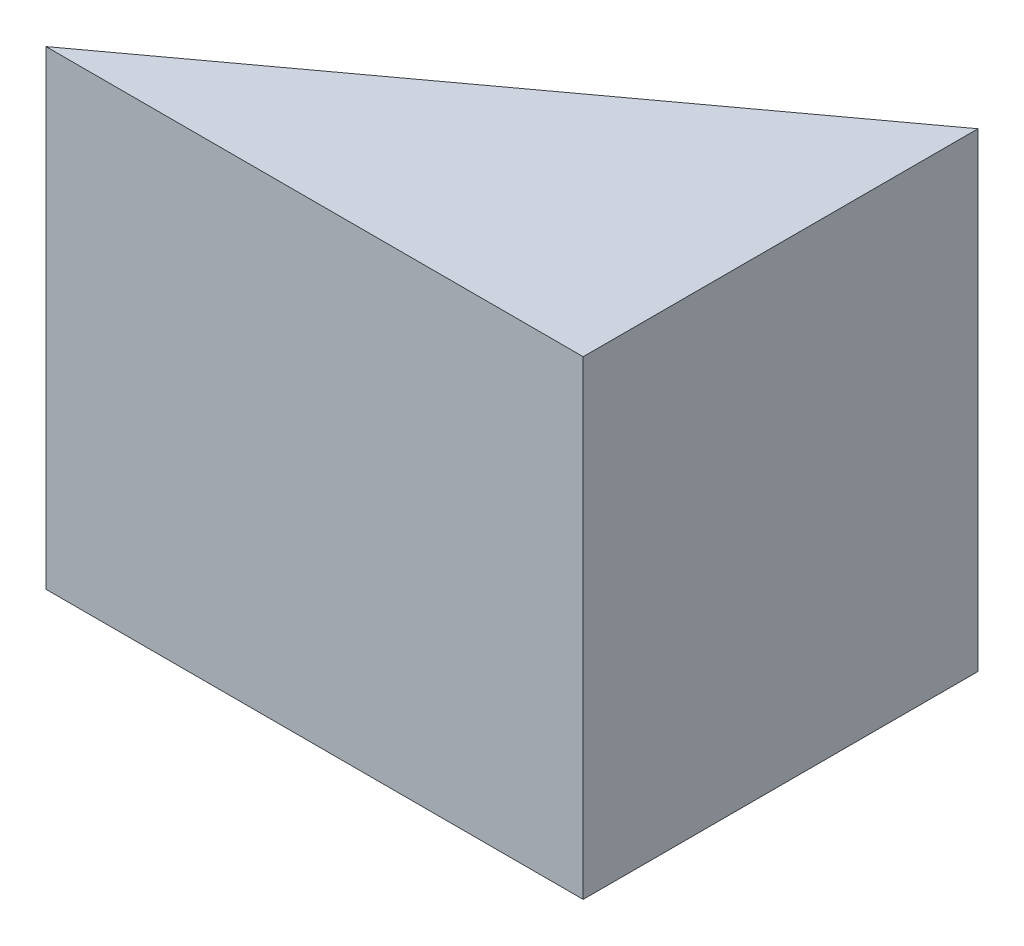
ISO-10303-21;
HEADER;
FILE_DESCRIPTION(('STEP AP214'),'2;1');
FILE_NAME('part.step','',(''),(''),'','','');
FILE_SCHEMA(('AUTOMOTIVE_DESIGN { 1 0 10303 214 1 1 1 1 }'));
ENDSEC;
DATA;
#1=APPLICATION_CONTEXT('core data for automotive mechanical design processes');
#2=APPLICATION_PROTOCOL_DEFINITION('international standard','automotive_design',2000,#1);
#3=PRODUCT_CONTEXT('',#1,'mechanical');
#4=PRODUCT('Part','Part','',(#3));
#5=PRODUCT_RELATED_PRODUCT_CATEGORY('part','',(#4));
#6=PRODUCT_DEFINITION_FORMATION('','',#4);
#7=PRODUCT_DEFINITION_CONTEXT('part definition',#1,'design');
#8=PRODUCT_DEFINITION('design','',#6,#7);
#9=PRODUCT_DEFINITION_SHAPE('','',#8);
#10=(LENGTH_UNIT() NAMED_UNIT(*) SI_UNIT(.MILLI.,.METRE.));
#11=(NAMED_UNIT(*) PLANE_ANGLE_UNIT() SI_UNIT($,.RADIAN.));
#12=(NAMED_UNIT(*) SI_UNIT($,.STERADIAN.) SOLID_ANGLE_UNIT());
#13=UNCERTAINTY_MEASURE_WITH_UNIT(LENGTH_MEASURE(1.E-05),#10,'distance_accuracy_value','');
#14=(GEOMETRIC_REPRESENTATION_CONTEXT(3) GLOBAL_UNCERTAINTY_ASSIGNED_CONTEXT((#13)) GLOBAL_UNIT_ASSIGNED_CONTEXT((#10,
#11,#12)) REPRESENTATION_CONTEXT('',''));
#15=CARTESIAN_POINT('',(0.,0.,0.));
#16=DIRECTION('',(0.,0.,1.));
#17=DIRECTION('',(1.,0.,0.));
#18=AXIS2_PLACEMENT_3D('',#15,#16,#17);
#19=CARTESIAN_POINT('',(39.9719269952526,87.5,-91.6850049878959));
#20=DIRECTION('',(0.592236616100286,0.,0.805764103537805));
#21=DIRECTION('',(0.805764103537805,0.,-0.592236616100286));
#22=AXIS2_PLACEMENT_3D('',#19,#20,#21);
#23=PLANE('',#22);
#24=DIRECTION('',(-0.805764103537805,0.,0.592236616100286));
#25=VECTOR('',#24,1.);
#26=CARTESIAN_POINT('',(39.9719269952526,0.,-91.6850049878959));
#27=LINE('',#26,#25);
#28=CARTESIAN_POINT('',(39.9719269952526,0.,-91.6850049878959));
#29=VERTEX_POINT('',#28);
#30=CARTESIAN_POINT('',(-60.0280730047474,0.,-18.1850049878959));
#31=VERTEX_POINT('',#30);
#32=EDGE_CURVE('E85',#29,#31,#27,.T.);
#33=ORIENTED_EDGE('',*,*,#32,.T.);
#34=DIRECTION('',(0.,-1.,0.));
#35=VECTOR('',#34,1.);
#36=CARTESIAN_POINT('',(-60.0280730047474,87.5,-18.1850049878959));
#37=LINE('',#36,#35);
#38=CARTESIAN_POINT('',(-60.0280730047474,87.5,-18.1850049878959));
#39=VERTEX_POINT('',#38);
#40=EDGE_CURVE('E11',#39,#31,#37,.T.);
#41=ORIENTED_EDGE('',*,*,#40,.F.);
#42=DIRECTION('',(-0.805764103537805,0.,0.592236616100286));
#43=VECTOR('',#42,1.);
#44=CARTESIAN_POINT('',(39.9719269952526,87.5,-91.6850049878959));
#45=LINE('',#44,#43);
#46=CARTESIAN_POINT('',(39.9719269952526,87.5,-91.6850049878959));
#47=VERTEX_POINT('',#46);
#48=EDGE_CURVE('E78',#47,#39,#45,.T.);
#49=ORIENTED_EDGE('',*,*,#48,.F.);
#50=DIRECTION('',(0.,-1.,0.));
#51=VECTOR('',#50,1.);
#52=CARTESIAN_POINT('',(39.9719269952526,87.5,-91.6850049878959));
#53=LINE('',#52,#51);
#54=EDGE_CURVE('E86',#47,#29,#53,.T.);
#55=ORIENTED_EDGE('',*,*,#54,.T.);
#56=EDGE_LOOP('',(#33,#41,#49,#55));
#57=FACE_BOUND('',#56,.T.);
#58=ADVANCED_FACE('F38',(#57),#23,.F.);
#59=CARTESIAN_POINT('',(-60.0280730047474,87.5,-18.1850049878959));
#60=DIRECTION('',(0.,0.,-1.));
#61=DIRECTION('',(-1.,0.,0.));
#62=AXIS2_PLACEMENT_3D('',#59,#60,#61);
#63=PLANE('',#62);
#64=DIRECTION('',(1.,0.,0.));
#65=VECTOR('',#64,1.);
#66=CARTESIAN_POINT('',(-60.0280730047474,0.,-18.1850049878959));
#67=LINE('',#66,#65);
#68=CARTESIAN_POINT('',(39.9719269952526,0.,-18.1850049878959));
#69=VERTEX_POINT('',#68);
#70=EDGE_CURVE('E66',#31,#69,#67,.T.);
#71=ORIENTED_EDGE('',*,*,#70,.T.);
#72=DIRECTION('',(0.,-1.,0.));
#73=VECTOR('',#72,1.);
#74=CARTESIAN_POINT('',(39.9719269952526,87.5,-18.1850049878959));
#75=LINE('',#74,#73);
#76=CARTESIAN_POINT('',(39.9719269952526,87.5,-18.1850049878959));
#77=VERTEX_POINT('',#76);
#78=EDGE_CURVE('E46',#77,#69,#75,.T.);
#79=ORIENTED_EDGE('',*,*,#78,.F.);
#80=DIRECTION('',(1.,0.,0.));
#81=VECTOR('',#80,1.);
#82=CARTESIAN_POINT('',(-60.0280730047474,87.5,-18.1850049878959));
#83=LINE('',#82,#81);
#84=EDGE_CURVE('E74',#39,#77,#83,.T.);
#85=ORIENTED_EDGE('',*,*,#84,.F.);
#86=ORIENTED_EDGE('',*,*,#40,.T.);
#87=EDGE_LOOP('',(#71,#79,#85,#86));
#88=FACE_BOUND('',#87,.T.);
#89=ADVANCED_FACE('F75',(#88),#63,.F.);
#90=CARTESIAN_POINT('',(39.9719269952526,87.5,-18.1850049878959));
#91=DIRECTION('',(-1.,0.,0.));
#92=DIRECTION('',(0.,0.,1.));
#93=AXIS2_PLACEMENT_3D('',#90,#91,#92);
#94=PLANE('',#93);
#95=DIRECTION('',(0.,0.,-1.));
#96=VECTOR('',#95,1.);
#97=CARTESIAN_POINT('',(39.9719269952526,0.,-18.1850049878959));
#98=LINE('',#97,#96);
#99=EDGE_CURVE('E71',#69,#29,#98,.T.);
#100=ORIENTED_EDGE('',*,*,#99,.T.);
#101=ORIENTED_EDGE('',*,*,#54,.F.);
#102=DIRECTION('',(0.,0.,-1.));
#103=VECTOR('',#102,1.);
#104=CARTESIAN_POINT('',(39.9719269952526,87.5,-18.1850049878959));
#105=LINE('',#104,#103);
#106=EDGE_CURVE('E54',#77,#47,#105,.T.);
#107=ORIENTED_EDGE('',*,*,#106,.F.);
#108=ORIENTED_EDGE('',*,*,#78,.T.);
#109=EDGE_LOOP('',(#100,#101,#107,#108));
#110=FACE_BOUND('',#109,.T.);
#111=ADVANCED_FACE('F93',(#110),#94,.F.);
#112=CARTESIAN_POINT('',(0.,87.5,0.));
#113=DIRECTION('',(0.,-1.,0.));
#114=DIRECTION('',(0.,0.,-1.));
#115=AXIS2_PLACEMENT_3D('',#112,#113,#114);
#116=PLANE('',#115);
#117=ORIENTED_EDGE('',*,*,#48,.T.);
#118=ORIENTED_EDGE('',*,*,#84,.T.);
#119=ORIENTED_EDGE('',*,*,#106,.T.);
#120=EDGE_LOOP('',(#117,#118,#119));
#121=FACE_BOUND('',#120,.T.);
#122=ADVANCED_FACE('F81',(#121),#116,.F.);
#123=CARTESIAN_POINT('',(0.,0.,0.));
#124=DIRECTION('',(0.,-1.,0.));
#125=DIRECTION('',(0.,0.,-1.));
#126=AXIS2_PLACEMENT_3D('',#123,#124,#125);
#127=PLANE('',#126);
#128=ORIENTED_EDGE('',*,*,#32,.F.);
#129=ORIENTED_EDGE('',*,*,#99,.F.);
#130=ORIENTED_EDGE('',*,*,#70,.F.);
#131=EDGE_LOOP('',(#128,#129,#130));
#132=FACE_BOUND('',#131,.T.);
#133=ADVANCED_FACE('F94',(#132),#127,.T.);
#134=CLOSED_SHELL('',(#58,#89,#111,#122,#133));
#135=MANIFOLD_SOLID_BREP('B2',#134);
#136=ADVANCED_BREP_SHAPE_REPRESENTATION('',(#18,#135),#14);
#137=SHAPE_DEFINITION_REPRESENTATION(#9,#136);
ENDSEC;
END-ISO-10303-21;
